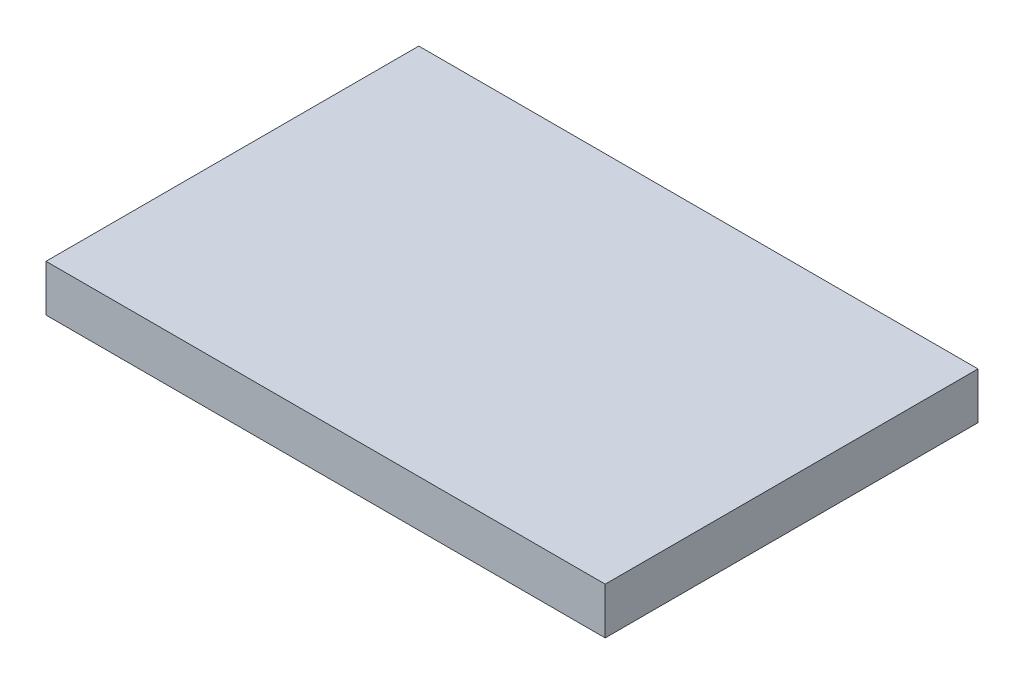
ISO-10303-21;
HEADER;
FILE_DESCRIPTION(('STEP AP214'),'2;1');
FILE_NAME('part.step','',(''),(''),'','','');
FILE_SCHEMA(('AUTOMOTIVE_DESIGN { 1 0 10303 214 1 1 1 1 }'));
ENDSEC;
DATA;
#1=APPLICATION_CONTEXT('core data for automotive mechanical design processes');
#2=APPLICATION_PROTOCOL_DEFINITION('international standard','automotive_design',2000,#1);
#3=PRODUCT_CONTEXT('',#1,'mechanical');
#4=PRODUCT('Part','Part','',(#3));
#5=PRODUCT_RELATED_PRODUCT_CATEGORY('part','',(#4));
#6=PRODUCT_DEFINITION_FORMATION('','',#4);
#7=PRODUCT_DEFINITION_CONTEXT('part definition',#1,'design');
#8=PRODUCT_DEFINITION('design','',#6,#7);
#9=PRODUCT_DEFINITION_SHAPE('','',#8);
#10=(LENGTH_UNIT() NAMED_UNIT(*) SI_UNIT(.MILLI.,.METRE.));
#11=(NAMED_UNIT(*) PLANE_ANGLE_UNIT() SI_UNIT($,.RADIAN.));
#12=(NAMED_UNIT(*) SI_UNIT($,.STERADIAN.) SOLID_ANGLE_UNIT());
#13=UNCERTAINTY_MEASURE_WITH_UNIT(LENGTH_MEASURE(1.E-05),#10,'distance_accuracy_value','');
#14=(GEOMETRIC_REPRESENTATION_CONTEXT(3) GLOBAL_UNCERTAINTY_ASSIGNED_CONTEXT((#13)) GLOBAL_UNIT_ASSIGNED_CONTEXT((#10,
#11,#12)) REPRESENTATION_CONTEXT('',''));
#15=CARTESIAN_POINT('',(0.,0.,0.));
#16=DIRECTION('',(0.,0.,1.));
#17=DIRECTION('',(1.,0.,0.));
#18=AXIS2_PLACEMENT_3D('',#15,#16,#17);
#19=CARTESIAN_POINT('',(0.,1.,0.));
#20=DIRECTION('',(1.,0.,0.));
#21=DIRECTION('',(0.,0.,-1.));
#22=AXIS2_PLACEMENT_3D('',#19,#20,#21);
#23=PLANE('',#22);
#24=DIRECTION('',(0.,0.,1.));
#25=VECTOR('',#24,1.);
#26=CARTESIAN_POINT('',(0.,0.,0.));
#27=LINE('',#26,#25);
#28=CARTESIAN_POINT('',(0.,0.,-8.));
#29=VERTEX_POINT('',#28);
#30=CARTESIAN_POINT('',(0.,0.,0.));
#31=VERTEX_POINT('',#30);
#32=EDGE_CURVE('E96',#29,#31,#27,.T.);
#33=ORIENTED_EDGE('',*,*,#32,.T.);
#34=DIRECTION('',(0.,-1.,0.));
#35=VECTOR('',#34,1.);
#36=CARTESIAN_POINT('',(0.,1.,0.));
#37=LINE('',#36,#35);
#38=CARTESIAN_POINT('',(0.,1.,0.));
#39=VERTEX_POINT('',#38);
#40=EDGE_CURVE('E11',#39,#31,#37,.T.);
#41=ORIENTED_EDGE('',*,*,#40,.F.);
#42=DIRECTION('',(0.,0.,1.));
#43=VECTOR('',#42,1.);
#44=CARTESIAN_POINT('',(0.,1.,0.));
#45=LINE('',#44,#43);
#46=CARTESIAN_POINT('',(0.,1.,-8.));
#47=VERTEX_POINT('',#46);
#48=EDGE_CURVE('E84',#47,#39,#45,.T.);
#49=ORIENTED_EDGE('',*,*,#48,.F.);
#50=DIRECTION('',(0.,-1.,0.));
#51=VECTOR('',#50,1.);
#52=CARTESIAN_POINT('',(0.,1.,-8.));
#53=LINE('',#52,#51);
#54=EDGE_CURVE('E92',#47,#29,#53,.T.);
#55=ORIENTED_EDGE('',*,*,#54,.T.);
#56=EDGE_LOOP('',(#33,#41,#49,#55));
#57=FACE_BOUND('',#56,.T.);
#58=ADVANCED_FACE('F33',(#57),#23,.F.);
#59=CARTESIAN_POINT('',(0.,1.,0.));
#60=DIRECTION('',(0.,0.,-1.));
#61=DIRECTION('',(-1.,0.,0.));
#62=AXIS2_PLACEMENT_3D('',#59,#60,#61);
#63=PLANE('',#62);
#64=DIRECTION('',(1.,0.,0.));
#65=VECTOR('',#64,1.);
#66=CARTESIAN_POINT('',(0.,0.,0.));
#67=LINE('',#66,#65);
#68=CARTESIAN_POINT('',(12.,0.,0.));
#69=VERTEX_POINT('',#68);
#70=EDGE_CURVE('E88',#31,#69,#67,.T.);
#71=ORIENTED_EDGE('',*,*,#70,.T.);
#72=DIRECTION('',(0.,-1.,0.));
#73=VECTOR('',#72,1.);
#74=CARTESIAN_POINT('',(12.,1.,0.));
#75=LINE('',#74,#73);
#76=CARTESIAN_POINT('',(12.,1.,0.));
#77=VERTEX_POINT('',#76);
#78=EDGE_CURVE('E41',#77,#69,#75,.T.);
#79=ORIENTED_EDGE('',*,*,#78,.F.);
#80=DIRECTION('',(1.,0.,0.));
#81=VECTOR('',#80,1.);
#82=CARTESIAN_POINT('',(0.,1.,0.));
#83=LINE('',#82,#81);
#84=EDGE_CURVE('E79',#39,#77,#83,.T.);
#85=ORIENTED_EDGE('',*,*,#84,.F.);
#86=ORIENTED_EDGE('',*,*,#40,.T.);
#87=EDGE_LOOP('',(#71,#79,#85,#86));
#88=FACE_BOUND('',#87,.T.);
#89=ADVANCED_FACE('F87',(#88),#63,.F.);
#90=CARTESIAN_POINT('',(12.,1.,0.));
#91=DIRECTION('',(-1.,0.,0.));
#92=DIRECTION('',(0.,0.,1.));
#93=AXIS2_PLACEMENT_3D('',#90,#91,#92);
#94=PLANE('',#93);
#95=DIRECTION('',(0.,0.,-1.));
#96=VECTOR('',#95,1.);
#97=CARTESIAN_POINT('',(12.,0.,0.));
#98=LINE('',#97,#96);
#99=CARTESIAN_POINT('',(12.,0.,-8.));
#100=VERTEX_POINT('',#99);
#101=EDGE_CURVE('E66',#69,#100,#98,.T.);
#102=ORIENTED_EDGE('',*,*,#101,.T.);
#103=DIRECTION('',(0.,-1.,0.));
#104=VECTOR('',#103,1.);
#105=CARTESIAN_POINT('',(12.,1.,-8.));
#106=LINE('',#105,#104);
#107=CARTESIAN_POINT('',(12.,1.,-8.));
#108=VERTEX_POINT('',#107);
#109=EDGE_CURVE('E89',#108,#100,#106,.T.);
#110=ORIENTED_EDGE('',*,*,#109,.F.);
#111=DIRECTION('',(0.,0.,-1.));
#112=VECTOR('',#111,1.);
#113=CARTESIAN_POINT('',(12.,1.,0.));
#114=LINE('',#113,#112);
#115=EDGE_CURVE('E82',#77,#108,#114,.T.);
#116=ORIENTED_EDGE('',*,*,#115,.F.);
#117=ORIENTED_EDGE('',*,*,#78,.T.);
#118=EDGE_LOOP('',(#102,#110,#116,#117));
#119=FACE_BOUND('',#118,.T.);
#120=ADVANCED_FACE('F90',(#119),#94,.F.);
#121=CARTESIAN_POINT('',(0.,1.,-8.));
#122=DIRECTION('',(0.,0.,1.));
#123=DIRECTION('',(1.,0.,0.));
#124=AXIS2_PLACEMENT_3D('',#121,#122,#123);
#125=PLANE('',#124);
#126=DIRECTION('',(-1.,0.,0.));
#127=VECTOR('',#126,1.);
#128=CARTESIAN_POINT('',(0.,0.,-8.));
#129=LINE('',#128,#127);
#130=EDGE_CURVE('E72',#100,#29,#129,.T.);
#131=ORIENTED_EDGE('',*,*,#130,.T.);
#132=ORIENTED_EDGE('',*,*,#54,.F.);
#133=DIRECTION('',(-1.,0.,0.));
#134=VECTOR('',#133,1.);
#135=CARTESIAN_POINT('',(0.,1.,-8.));
#136=LINE('',#135,#134);
#137=EDGE_CURVE('E49',#108,#47,#136,.T.);
#138=ORIENTED_EDGE('',*,*,#137,.F.);
#139=ORIENTED_EDGE('',*,*,#109,.T.);
#140=EDGE_LOOP('',(#131,#132,#138,#139));
#141=FACE_BOUND('',#140,.T.);
#142=ADVANCED_FACE('F103',(#141),#125,.F.);
#143=CARTESIAN_POINT('',(0.,1.,0.));
#144=DIRECTION('',(0.,-1.,0.));
#145=DIRECTION('',(0.,0.,-1.));
#146=AXIS2_PLACEMENT_3D('',#143,#144,#145);
#147=PLANE('',#146);
#148=ORIENTED_EDGE('',*,*,#48,.T.);
#149=ORIENTED_EDGE('',*,*,#84,.T.);
#150=ORIENTED_EDGE('',*,*,#115,.T.);
#151=ORIENTED_EDGE('',*,*,#137,.T.);
#152=EDGE_LOOP('',(#148,#149,#150,#151));
#153=FACE_BOUND('',#152,.T.);
#154=ADVANCED_FACE('F80',(#153),#147,.F.);
#155=CARTESIAN_POINT('',(0.,0.,0.));
#156=DIRECTION('',(0.,-1.,0.));
#157=DIRECTION('',(0.,0.,-1.));
#158=AXIS2_PLACEMENT_3D('',#155,#156,#157);
#159=PLANE('',#158);
#160=ORIENTED_EDGE('',*,*,#32,.F.);
#161=ORIENTED_EDGE('',*,*,#130,.F.);
#162=ORIENTED_EDGE('',*,*,#101,.F.);
#163=ORIENTED_EDGE('',*,*,#70,.F.);
#164=EDGE_LOOP('',(#160,#161,#162,#163));
#165=FACE_BOUND('',#164,.T.);
#166=ADVANCED_FACE('F106',(#165),#159,.T.);
#167=CLOSED_SHELL('',(#58,#89,#120,#142,#154,#166));
#168=MANIFOLD_SOLID_BREP('B2',#167);
#169=ADVANCED_BREP_SHAPE_REPRESENTATION('',(#18,#168),#14);
#170=SHAPE_DEFINITION_REPRESENTATION(#9,#169);
ENDSEC;
END-ISO-10303-21;
